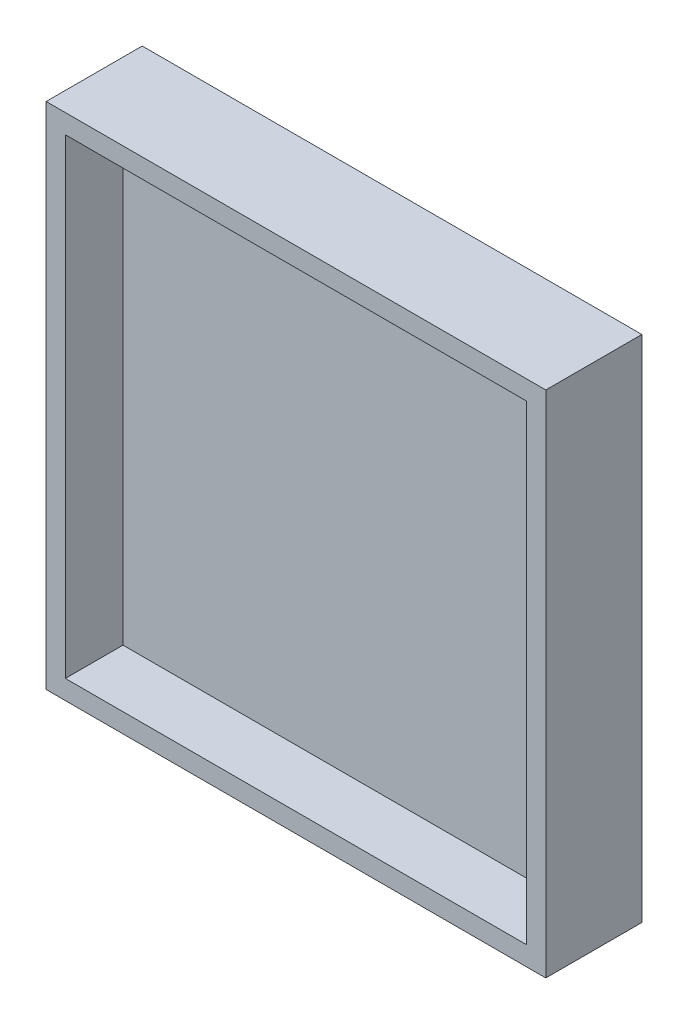
ISO-10303-21;
HEADER;
FILE_DESCRIPTION(('STEP AP214'),'2;1');
FILE_NAME('part.step','',(''),(''),'','','');
FILE_SCHEMA(('AUTOMOTIVE_DESIGN { 1 0 10303 214 1 1 1 1 }'));
ENDSEC;
DATA;
#1=APPLICATION_CONTEXT('core data for automotive mechanical design processes');
#2=APPLICATION_PROTOCOL_DEFINITION('international standard','automotive_design',2000,#1);
#3=PRODUCT_CONTEXT('',#1,'mechanical');
#4=PRODUCT('Part','Part','',(#3));
#5=PRODUCT_RELATED_PRODUCT_CATEGORY('part','',(#4));
#6=PRODUCT_DEFINITION_FORMATION('','',#4);
#7=PRODUCT_DEFINITION_CONTEXT('part definition',#1,'design');
#8=PRODUCT_DEFINITION('design','',#6,#7);
#9=PRODUCT_DEFINITION_SHAPE('','',#8);
#10=(LENGTH_UNIT() NAMED_UNIT(*) SI_UNIT(.MILLI.,.METRE.));
#11=(NAMED_UNIT(*) PLANE_ANGLE_UNIT() SI_UNIT($,.RADIAN.));
#12=(NAMED_UNIT(*) SI_UNIT($,.STERADIAN.) SOLID_ANGLE_UNIT());
#13=UNCERTAINTY_MEASURE_WITH_UNIT(LENGTH_MEASURE(1.E-05),#10,'distance_accuracy_value','');
#14=(GEOMETRIC_REPRESENTATION_CONTEXT(3) GLOBAL_UNCERTAINTY_ASSIGNED_CONTEXT((#13)) GLOBAL_UNIT_ASSIGNED_CONTEXT((#10,
#11,#12)) REPRESENTATION_CONTEXT('',''));
#15=CARTESIAN_POINT('',(0.,0.,0.));
#16=DIRECTION('',(0.,0.,1.));
#17=DIRECTION('',(1.,0.,0.));
#18=AXIS2_PLACEMENT_3D('',#15,#16,#17);
#19=CARTESIAN_POINT('',(0.,0.,3.));
#20=DIRECTION('',(0.,0.,-1.));
#21=DIRECTION('',(-1.,0.,0.));
#22=AXIS2_PLACEMENT_3D('',#19,#20,#21);
#23=PLANE('',#22);
#24=DIRECTION('',(0.,-1.,0.));
#25=VECTOR('',#24,1.);
#26=CARTESIAN_POINT('',(-1.,-0.999999999999997,3.));
#27=LINE('',#26,#25);
#28=CARTESIAN_POINT('',(-1.,25.5,3.));
#29=VERTEX_POINT('',#28);
#30=CARTESIAN_POINT('',(-1.,-0.999999999999997,3.));
#31=VERTEX_POINT('',#30);
#32=EDGE_CURVE('E152',#29,#31,#27,.T.);
#33=ORIENTED_EDGE('',*,*,#32,.T.);
#34=DIRECTION('',(1.,0.,0.));
#35=VECTOR('',#34,1.);
#36=CARTESIAN_POINT('',(-1.,-0.999999999999997,3.));
#37=LINE('',#36,#35);
#38=CARTESIAN_POINT('',(25.,-0.999999999999997,3.));
#39=VERTEX_POINT('',#38);
#40=EDGE_CURVE('E155',#31,#39,#37,.T.);
#41=ORIENTED_EDGE('',*,*,#40,.T.);
#42=DIRECTION('',(0.,1.,0.));
#43=VECTOR('',#42,1.);
#44=CARTESIAN_POINT('',(25.,-0.999999999999997,3.));
#45=LINE('',#44,#43);
#46=CARTESIAN_POINT('',(25.,25.5,3.));
#47=VERTEX_POINT('',#46);
#48=EDGE_CURVE('E107',#39,#47,#45,.T.);
#49=ORIENTED_EDGE('',*,*,#48,.T.);
#50=DIRECTION('',(-1.,0.,0.));
#51=VECTOR('',#50,1.);
#52=CARTESIAN_POINT('',(-1.,25.5,3.));
#53=LINE('',#52,#51);
#54=EDGE_CURVE('E158',#47,#29,#53,.T.);
#55=ORIENTED_EDGE('',*,*,#54,.T.);
#56=EDGE_LOOP('',(#33,#41,#49,#55));
#57=FACE_BOUND('',#56,.T.);
#58=DIRECTION('',(0.,-1.,0.));
#59=VECTOR('',#58,1.);
#60=CARTESIAN_POINT('',(0.,0.,3.));
#61=LINE('',#60,#59);
#62=CARTESIAN_POINT('',(0.,24.5,3.));
#63=VERTEX_POINT('',#62);
#64=CARTESIAN_POINT('',(0.,0.,3.));
#65=VERTEX_POINT('',#64);
#66=EDGE_CURVE('E127',#63,#65,#61,.T.);
#67=ORIENTED_EDGE('',*,*,#66,.F.);
#68=DIRECTION('',(-1.,0.,0.));
#69=VECTOR('',#68,1.);
#70=CARTESIAN_POINT('',(0.,24.5,3.));
#71=LINE('',#70,#69);
#72=CARTESIAN_POINT('',(24.,24.5,3.));
#73=VERTEX_POINT('',#72);
#74=EDGE_CURVE('E134',#73,#63,#71,.T.);
#75=ORIENTED_EDGE('',*,*,#74,.F.);
#76=DIRECTION('',(0.,1.,0.));
#77=VECTOR('',#76,1.);
#78=CARTESIAN_POINT('',(24.,0.,3.));
#79=LINE('',#78,#77);
#80=CARTESIAN_POINT('',(24.,0.,3.));
#81=VERTEX_POINT('',#80);
#82=EDGE_CURVE('E132',#81,#73,#79,.T.);
#83=ORIENTED_EDGE('',*,*,#82,.F.);
#84=DIRECTION('',(1.,0.,0.));
#85=VECTOR('',#84,1.);
#86=CARTESIAN_POINT('',(0.,0.,3.));
#87=LINE('',#86,#85);
#88=EDGE_CURVE('E129',#65,#81,#87,.T.);
#89=ORIENTED_EDGE('',*,*,#88,.F.);
#90=EDGE_LOOP('',(#67,#75,#83,#89));
#91=FACE_BOUND('',#90,.T.);
#92=ADVANCED_FACE('F35',(#57,#91),#23,.F.);
#93=CARTESIAN_POINT('',(-1.,-0.999999999999997,3.));
#94=DIRECTION('',(1.,0.,0.));
#95=DIRECTION('',(0.,0.,-1.));
#96=AXIS2_PLACEMENT_3D('',#93,#94,#95);
#97=PLANE('',#96);
#98=DIRECTION('',(0.,0.,-1.));
#99=VECTOR('',#98,1.);
#100=CARTESIAN_POINT('',(-1.,25.5,3.));
#101=LINE('',#100,#99);
#102=CARTESIAN_POINT('',(-1.,25.5,-2.));
#103=VERTEX_POINT('',#102);
#104=EDGE_CURVE('E160',#29,#103,#101,.T.);
#105=ORIENTED_EDGE('',*,*,#104,.T.);
#106=DIRECTION('',(0.,1.,0.));
#107=VECTOR('',#106,1.);
#108=CARTESIAN_POINT('',(-1.,25.5,-2.));
#109=LINE('',#108,#107);
#110=CARTESIAN_POINT('',(-1.,-0.999999999999997,-2.));
#111=VERTEX_POINT('',#110);
#112=EDGE_CURVE('E117',#111,#103,#109,.T.);
#113=ORIENTED_EDGE('',*,*,#112,.F.);
#114=DIRECTION('',(0.,0.,-1.));
#115=VECTOR('',#114,1.);
#116=CARTESIAN_POINT('',(-1.,-0.999999999999997,3.));
#117=LINE('',#116,#115);
#118=EDGE_CURVE('E11',#31,#111,#117,.T.);
#119=ORIENTED_EDGE('',*,*,#118,.F.);
#120=ORIENTED_EDGE('',*,*,#32,.F.);
#121=EDGE_LOOP('',(#105,#113,#119,#120));
#122=FACE_BOUND('',#121,.T.);
#123=ADVANCED_FACE('F37',(#122),#97,.F.);
#124=CARTESIAN_POINT('',(-1.,-0.999999999999997,3.));
#125=DIRECTION('',(0.,1.,0.));
#126=DIRECTION('',(0.,0.,1.));
#127=AXIS2_PLACEMENT_3D('',#124,#125,#126);
#128=PLANE('',#127);
#129=ORIENTED_EDGE('',*,*,#118,.T.);
#130=DIRECTION('',(-1.,0.,0.));
#131=VECTOR('',#130,1.);
#132=CARTESIAN_POINT('',(25.,-0.999999999999997,-2.));
#133=LINE('',#132,#131);
#134=CARTESIAN_POINT('',(25.,-0.999999999999997,-2.));
#135=VERTEX_POINT('',#134);
#136=EDGE_CURVE('E111',#135,#111,#133,.T.);
#137=ORIENTED_EDGE('',*,*,#136,.F.);
#138=DIRECTION('',(0.,0.,-1.));
#139=VECTOR('',#138,1.);
#140=CARTESIAN_POINT('',(25.,-0.999999999999997,3.));
#141=LINE('',#140,#139);
#142=EDGE_CURVE('E43',#39,#135,#141,.T.);
#143=ORIENTED_EDGE('',*,*,#142,.F.);
#144=ORIENTED_EDGE('',*,*,#40,.F.);
#145=EDGE_LOOP('',(#129,#137,#143,#144));
#146=FACE_BOUND('',#145,.T.);
#147=ADVANCED_FACE('F112',(#146),#128,.F.);
#148=CARTESIAN_POINT('',(25.,-0.999999999999997,3.));
#149=DIRECTION('',(-1.,0.,0.));
#150=DIRECTION('',(0.,-1.,0.));
#151=AXIS2_PLACEMENT_3D('',#148,#149,#150);
#152=PLANE('',#151);
#153=ORIENTED_EDGE('',*,*,#142,.T.);
#154=DIRECTION('',(0.,-1.,0.));
#155=VECTOR('',#154,1.);
#156=CARTESIAN_POINT('',(25.,25.5,-2.));
#157=LINE('',#156,#155);
#158=CARTESIAN_POINT('',(25.,25.5,-2.));
#159=VERTEX_POINT('',#158);
#160=EDGE_CURVE('E106',#159,#135,#157,.T.);
#161=ORIENTED_EDGE('',*,*,#160,.F.);
#162=DIRECTION('',(0.,0.,-1.));
#163=VECTOR('',#162,1.);
#164=CARTESIAN_POINT('',(25.,25.5,3.));
#165=LINE('',#164,#163);
#166=EDGE_CURVE('E109',#47,#159,#165,.T.);
#167=ORIENTED_EDGE('',*,*,#166,.F.);
#168=ORIENTED_EDGE('',*,*,#48,.F.);
#169=EDGE_LOOP('',(#153,#161,#167,#168));
#170=FACE_BOUND('',#169,.T.);
#171=ADVANCED_FACE('F103',(#170),#152,.F.);
#172=CARTESIAN_POINT('',(-1.,25.5,3.));
#173=DIRECTION('',(0.,-1.,0.));
#174=DIRECTION('',(0.,0.,-1.));
#175=AXIS2_PLACEMENT_3D('',#172,#173,#174);
#176=PLANE('',#175);
#177=ORIENTED_EDGE('',*,*,#166,.T.);
#178=DIRECTION('',(1.,0.,0.));
#179=VECTOR('',#178,1.);
#180=CARTESIAN_POINT('',(25.,25.5,-2.));
#181=LINE('',#180,#179);
#182=EDGE_CURVE('E122',#103,#159,#181,.T.);
#183=ORIENTED_EDGE('',*,*,#182,.F.);
#184=ORIENTED_EDGE('',*,*,#104,.F.);
#185=ORIENTED_EDGE('',*,*,#54,.F.);
#186=EDGE_LOOP('',(#177,#183,#184,#185));
#187=FACE_BOUND('',#186,.T.);
#188=ADVANCED_FACE('F164',(#187),#176,.F.);
#189=CARTESIAN_POINT('',(0.,0.,3.));
#190=DIRECTION('',(1.,0.,0.));
#191=DIRECTION('',(0.,1.,0.));
#192=AXIS2_PLACEMENT_3D('',#189,#190,#191);
#193=PLANE('',#192);
#194=DIRECTION('',(0.,-1.,0.));
#195=VECTOR('',#194,1.);
#196=CARTESIAN_POINT('',(0.,0.,0.));
#197=LINE('',#196,#195);
#198=CARTESIAN_POINT('',(0.,24.5,0.));
#199=VERTEX_POINT('',#198);
#200=CARTESIAN_POINT('',(0.,0.,0.));
#201=VERTEX_POINT('',#200);
#202=EDGE_CURVE('E58',#199,#201,#197,.T.);
#203=ORIENTED_EDGE('',*,*,#202,.F.);
#204=DIRECTION('',(0.,0.,-1.));
#205=VECTOR('',#204,1.);
#206=CARTESIAN_POINT('',(0.,24.5,3.));
#207=LINE('',#206,#205);
#208=EDGE_CURVE('E136',#63,#199,#207,.T.);
#209=ORIENTED_EDGE('',*,*,#208,.F.);
#210=ORIENTED_EDGE('',*,*,#66,.T.);
#211=DIRECTION('',(0.,0.,-1.));
#212=VECTOR('',#211,1.);
#213=CARTESIAN_POINT('',(0.,0.,3.));
#214=LINE('',#213,#212);
#215=EDGE_CURVE('E150',#65,#201,#214,.T.);
#216=ORIENTED_EDGE('',*,*,#215,.T.);
#217=EDGE_LOOP('',(#203,#209,#210,#216));
#218=FACE_BOUND('',#217,.T.);
#219=ADVANCED_FACE('F180',(#218),#193,.T.);
#220=CARTESIAN_POINT('',(0.,0.,3.));
#221=DIRECTION('',(0.,1.,0.));
#222=DIRECTION('',(0.,0.,1.));
#223=AXIS2_PLACEMENT_3D('',#220,#221,#222);
#224=PLANE('',#223);
#225=DIRECTION('',(1.,0.,0.));
#226=VECTOR('',#225,1.);
#227=CARTESIAN_POINT('',(0.,0.,0.));
#228=LINE('',#227,#226);
#229=CARTESIAN_POINT('',(24.,0.,0.));
#230=VERTEX_POINT('',#229);
#231=EDGE_CURVE('E138',#201,#230,#228,.T.);
#232=ORIENTED_EDGE('',*,*,#231,.F.);
#233=ORIENTED_EDGE('',*,*,#215,.F.);
#234=ORIENTED_EDGE('',*,*,#88,.T.);
#235=DIRECTION('',(0.,0.,-1.));
#236=VECTOR('',#235,1.);
#237=CARTESIAN_POINT('',(24.,0.,3.));
#238=LINE('',#237,#236);
#239=EDGE_CURVE('E148',#81,#230,#238,.T.);
#240=ORIENTED_EDGE('',*,*,#239,.T.);
#241=EDGE_LOOP('',(#232,#233,#234,#240));
#242=FACE_BOUND('',#241,.T.);
#243=ADVANCED_FACE('F199',(#242),#224,.T.);
#244=CARTESIAN_POINT('',(24.,0.,3.));
#245=DIRECTION('',(-1.,0.,0.));
#246=DIRECTION('',(0.,-1.,0.));
#247=AXIS2_PLACEMENT_3D('',#244,#245,#246);
#248=PLANE('',#247);
#249=DIRECTION('',(0.,1.,0.));
#250=VECTOR('',#249,1.);
#251=CARTESIAN_POINT('',(24.,0.,0.));
#252=LINE('',#251,#250);
#253=CARTESIAN_POINT('',(24.,24.5,0.));
#254=VERTEX_POINT('',#253);
#255=EDGE_CURVE('E141',#230,#254,#252,.T.);
#256=ORIENTED_EDGE('',*,*,#255,.F.);
#257=ORIENTED_EDGE('',*,*,#239,.F.);
#258=ORIENTED_EDGE('',*,*,#82,.T.);
#259=DIRECTION('',(0.,0.,-1.));
#260=VECTOR('',#259,1.);
#261=CARTESIAN_POINT('',(24.,24.5,3.));
#262=LINE('',#261,#260);
#263=EDGE_CURVE('E50',#73,#254,#262,.T.);
#264=ORIENTED_EDGE('',*,*,#263,.T.);
#265=EDGE_LOOP('',(#256,#257,#258,#264));
#266=FACE_BOUND('',#265,.T.);
#267=ADVANCED_FACE('F205',(#266),#248,.T.);
#268=CARTESIAN_POINT('',(0.,24.5,3.));
#269=DIRECTION('',(0.,-1.,0.));
#270=DIRECTION('',(0.,0.,-1.));
#271=AXIS2_PLACEMENT_3D('',#268,#269,#270);
#272=PLANE('',#271);
#273=DIRECTION('',(-1.,0.,0.));
#274=VECTOR('',#273,1.);
#275=CARTESIAN_POINT('',(0.,24.5,0.));
#276=LINE('',#275,#274);
#277=EDGE_CURVE('E130',#254,#199,#276,.T.);
#278=ORIENTED_EDGE('',*,*,#277,.F.);
#279=ORIENTED_EDGE('',*,*,#263,.F.);
#280=ORIENTED_EDGE('',*,*,#74,.T.);
#281=ORIENTED_EDGE('',*,*,#208,.T.);
#282=EDGE_LOOP('',(#278,#279,#280,#281));
#283=FACE_BOUND('',#282,.T.);
#284=ADVANCED_FACE('F212',(#283),#272,.T.);
#285=CARTESIAN_POINT('',(0.,0.,0.));
#286=DIRECTION('',(0.,0.,-1.));
#287=DIRECTION('',(-1.,0.,0.));
#288=AXIS2_PLACEMENT_3D('',#285,#286,#287);
#289=PLANE('',#288);
#290=ORIENTED_EDGE('',*,*,#255,.T.);
#291=ORIENTED_EDGE('',*,*,#277,.T.);
#292=ORIENTED_EDGE('',*,*,#202,.T.);
#293=ORIENTED_EDGE('',*,*,#231,.T.);
#294=EDGE_LOOP('',(#290,#291,#292,#293));
#295=FACE_BOUND('',#294,.T.);
#296=ADVANCED_FACE('F220',(#295),#289,.F.);
#297=CARTESIAN_POINT('',(0.,0.,-2.));
#298=DIRECTION('',(0.,0.,-1.));
#299=DIRECTION('',(-1.,0.,0.));
#300=AXIS2_PLACEMENT_3D('',#297,#298,#299);
#301=PLANE('',#300);
#302=ORIENTED_EDGE('',*,*,#160,.T.);
#303=ORIENTED_EDGE('',*,*,#136,.T.);
#304=ORIENTED_EDGE('',*,*,#112,.T.);
#305=ORIENTED_EDGE('',*,*,#182,.T.);
#306=EDGE_LOOP('',(#302,#303,#304,#305));
#307=FACE_BOUND('',#306,.T.);
#308=ADVANCED_FACE('F120',(#307),#301,.T.);
#309=CLOSED_SHELL('',(#92,#123,#147,#171,#188,#219,#243,#267,#284,#296,#308));
#310=MANIFOLD_SOLID_BREP('B2',#309);
#311=ADVANCED_BREP_SHAPE_REPRESENTATION('',(#18,#310),#14);
#312=SHAPE_DEFINITION_REPRESENTATION(#9,#311);
ENDSEC;
END-ISO-10303-21;
